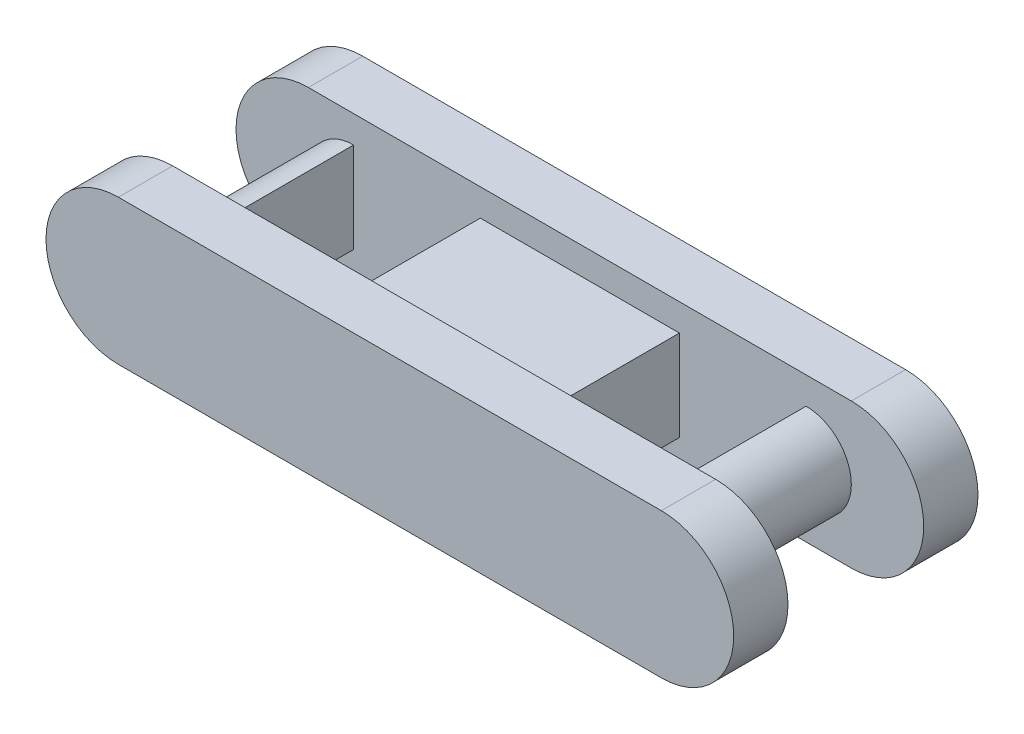
ISO-10303-21;
HEADER;
FILE_DESCRIPTION(('STEP AP214'),'2;1');
FILE_NAME('part.step','',(''),(''),'','','');
FILE_SCHEMA(('AUTOMOTIVE_DESIGN { 1 0 10303 214 1 1 1 1 }'));
ENDSEC;
DATA;
#1=APPLICATION_CONTEXT('core data for automotive mechanical design processes');
#2=APPLICATION_PROTOCOL_DEFINITION('international standard','automotive_design',2000,#1);
#3=PRODUCT_CONTEXT('',#1,'mechanical');
#4=PRODUCT('Part','Part','',(#3));
#5=PRODUCT_RELATED_PRODUCT_CATEGORY('part','',(#4));
#6=PRODUCT_DEFINITION_FORMATION('','',#4);
#7=PRODUCT_DEFINITION_CONTEXT('part definition',#1,'design');
#8=PRODUCT_DEFINITION('design','',#6,#7);
#9=PRODUCT_DEFINITION_SHAPE('','',#8);
#10=(LENGTH_UNIT() NAMED_UNIT(*) SI_UNIT(.MILLI.,.METRE.));
#11=(NAMED_UNIT(*) PLANE_ANGLE_UNIT() SI_UNIT($,.RADIAN.));
#12=(NAMED_UNIT(*) SI_UNIT($,.STERADIAN.) SOLID_ANGLE_UNIT());
#13=UNCERTAINTY_MEASURE_WITH_UNIT(LENGTH_MEASURE(1.E-05),#10,'distance_accuracy_value','');
#14=(GEOMETRIC_REPRESENTATION_CONTEXT(3) GLOBAL_UNCERTAINTY_ASSIGNED_CONTEXT((#13)) GLOBAL_UNIT_ASSIGNED_CONTEXT((#10,
#11,#12)) REPRESENTATION_CONTEXT('',''));
#15=CARTESIAN_POINT('',(0.,0.,0.));
#16=DIRECTION('',(0.,0.,1.));
#17=DIRECTION('',(1.,0.,0.));
#18=AXIS2_PLACEMENT_3D('',#15,#16,#17);
#19=CARTESIAN_POINT('',(15.,0.,3.));
#20=DIRECTION('',(0.,0.,-1.));
#21=DIRECTION('',(-1.,0.,0.));
#22=AXIS2_PLACEMENT_3D('',#19,#20,#21);
#23=CYLINDRICAL_SURFACE('',#22,4.);
#24=CARTESIAN_POINT('',(15.,0.,0.));
#25=DIRECTION('',(0.,0.,1.));
#26=DIRECTION('',(1.,0.,0.));
#27=AXIS2_PLACEMENT_3D('',#24,#25,#26);
#28=CIRCLE('',#27,4.);
#29=CARTESIAN_POINT('',(15.,-4.,0.));
#30=VERTEX_POINT('',#29);
#31=CARTESIAN_POINT('',(15.,4.,0.));
#32=VERTEX_POINT('',#31);
#33=EDGE_CURVE('E208',#30,#32,#28,.T.);
#34=ORIENTED_EDGE('',*,*,#33,.T.);
#35=DIRECTION('',(0.,0.,-1.));
#36=VECTOR('',#35,1.);
#37=CARTESIAN_POINT('',(15.,4.,3.));
#38=LINE('',#37,#36);
#39=CARTESIAN_POINT('',(15.,4.,3.));
#40=VERTEX_POINT('',#39);
#41=EDGE_CURVE('E11',#40,#32,#38,.T.);
#42=ORIENTED_EDGE('',*,*,#41,.F.);
#43=CARTESIAN_POINT('',(15.,0.,3.));
#44=DIRECTION('',(0.,0.,1.));
#45=DIRECTION('',(1.,0.,0.));
#46=AXIS2_PLACEMENT_3D('',#43,#44,#45);
#47=CIRCLE('',#46,4.);
#48=CARTESIAN_POINT('',(15.,-4.,3.));
#49=VERTEX_POINT('',#48);
#50=EDGE_CURVE('E209',#49,#40,#47,.T.);
#51=ORIENTED_EDGE('',*,*,#50,.F.);
#52=DIRECTION('',(0.,0.,-1.));
#53=VECTOR('',#52,1.);
#54=CARTESIAN_POINT('',(15.,-4.,3.));
#55=LINE('',#54,#53);
#56=EDGE_CURVE('E219',#49,#30,#55,.T.);
#57=ORIENTED_EDGE('',*,*,#56,.T.);
#58=EDGE_LOOP('',(#34,#42,#51,#57));
#59=FACE_BOUND('',#58,.T.);
#60=ADVANCED_FACE('F39',(#59),#23,.T.);
#61=CARTESIAN_POINT('',(-15.,4.,3.));
#62=DIRECTION('',(0.,-1.,0.));
#63=DIRECTION('',(0.,0.,-1.));
#64=AXIS2_PLACEMENT_3D('',#61,#62,#63);
#65=PLANE('',#64);
#66=DIRECTION('',(-1.,0.,0.));
#67=VECTOR('',#66,1.);
#68=CARTESIAN_POINT('',(-15.,4.,0.));
#69=LINE('',#68,#67);
#70=CARTESIAN_POINT('',(-15.,4.,0.));
#71=VERTEX_POINT('',#70);
#72=EDGE_CURVE('E222',#32,#71,#69,.T.);
#73=ORIENTED_EDGE('',*,*,#72,.T.);
#74=DIRECTION('',(0.,0.,-1.));
#75=VECTOR('',#74,1.);
#76=CARTESIAN_POINT('',(-15.,4.,3.));
#77=LINE('',#76,#75);
#78=CARTESIAN_POINT('',(-15.,4.,3.));
#79=VERTEX_POINT('',#78);
#80=EDGE_CURVE('E46',#79,#71,#77,.T.);
#81=ORIENTED_EDGE('',*,*,#80,.F.);
#82=DIRECTION('',(-1.,0.,0.));
#83=VECTOR('',#82,1.);
#84=CARTESIAN_POINT('',(-15.,4.,3.));
#85=LINE('',#84,#83);
#86=EDGE_CURVE('E212',#40,#79,#85,.T.);
#87=ORIENTED_EDGE('',*,*,#86,.F.);
#88=ORIENTED_EDGE('',*,*,#41,.T.);
#89=EDGE_LOOP('',(#73,#81,#87,#88));
#90=FACE_BOUND('',#89,.T.);
#91=ADVANCED_FACE('F252',(#90),#65,.F.);
#92=CARTESIAN_POINT('',(-15.,0.,3.));
#93=DIRECTION('',(0.,0.,-1.));
#94=DIRECTION('',(-1.,0.,0.));
#95=AXIS2_PLACEMENT_3D('',#92,#93,#94);
#96=CYLINDRICAL_SURFACE('',#95,4.);
#97=CARTESIAN_POINT('',(-15.,0.,0.));
#98=DIRECTION('',(0.,0.,1.));
#99=DIRECTION('',(1.,0.,0.));
#100=AXIS2_PLACEMENT_3D('',#97,#98,#99);
#101=CIRCLE('',#100,4.);
#102=CARTESIAN_POINT('',(-15.,-4.,0.));
#103=VERTEX_POINT('',#102);
#104=EDGE_CURVE('E224',#71,#103,#101,.T.);
#105=ORIENTED_EDGE('',*,*,#104,.T.);
#106=DIRECTION('',(0.,0.,-1.));
#107=VECTOR('',#106,1.);
#108=CARTESIAN_POINT('',(-15.,-4.,3.));
#109=LINE('',#108,#107);
#110=CARTESIAN_POINT('',(-15.,-4.,3.));
#111=VERTEX_POINT('',#110);
#112=EDGE_CURVE('E229',#111,#103,#109,.T.);
#113=ORIENTED_EDGE('',*,*,#112,.F.);
#114=CARTESIAN_POINT('',(-15.,0.,3.));
#115=DIRECTION('',(0.,0.,1.));
#116=DIRECTION('',(1.,0.,0.));
#117=AXIS2_PLACEMENT_3D('',#114,#115,#116);
#118=CIRCLE('',#117,4.);
#119=EDGE_CURVE('E215',#79,#111,#118,.T.);
#120=ORIENTED_EDGE('',*,*,#119,.F.);
#121=ORIENTED_EDGE('',*,*,#80,.T.);
#122=EDGE_LOOP('',(#105,#113,#120,#121));
#123=FACE_BOUND('',#122,.T.);
#124=ADVANCED_FACE('F236',(#123),#96,.T.);
#125=CARTESIAN_POINT('',(-15.,-4.,3.));
#126=DIRECTION('',(0.,1.,0.));
#127=DIRECTION('',(0.,0.,1.));
#128=AXIS2_PLACEMENT_3D('',#125,#126,#127);
#129=PLANE('',#128);
#130=DIRECTION('',(1.,0.,0.));
#131=VECTOR('',#130,1.);
#132=CARTESIAN_POINT('',(-15.,-4.,0.));
#133=LINE('',#132,#131);
#134=EDGE_CURVE('E213',#103,#30,#133,.T.);
#135=ORIENTED_EDGE('',*,*,#134,.T.);
#136=ORIENTED_EDGE('',*,*,#56,.F.);
#137=DIRECTION('',(1.,0.,0.));
#138=VECTOR('',#137,1.);
#139=CARTESIAN_POINT('',(-15.,-4.,3.));
#140=LINE('',#139,#138);
#141=EDGE_CURVE('E217',#111,#49,#140,.T.);
#142=ORIENTED_EDGE('',*,*,#141,.F.);
#143=ORIENTED_EDGE('',*,*,#112,.T.);
#144=EDGE_LOOP('',(#135,#136,#142,#143));
#145=FACE_BOUND('',#144,.T.);
#146=ADVANCED_FACE('F245',(#145),#129,.F.);
#147=CARTESIAN_POINT('',(15.,0.,3.));
#148=DIRECTION('',(0.,0.,1.));
#149=DIRECTION('',(1.,0.,0.));
#150=AXIS2_PLACEMENT_3D('',#147,#148,#149);
#151=PLANE('',#150);
#152=ORIENTED_EDGE('',*,*,#141,.T.);
#153=ORIENTED_EDGE('',*,*,#50,.T.);
#154=ORIENTED_EDGE('',*,*,#86,.T.);
#155=ORIENTED_EDGE('',*,*,#119,.T.);
#156=EDGE_LOOP('',(#152,#153,#154,#155));
#157=FACE_BOUND('',#156,.T.);
#158=DIRECTION('',(1.,0.,0.));
#159=VECTOR('',#158,1.);
#160=CARTESIAN_POINT('',(-12.5,-2.5,3.));
#161=LINE('',#160,#159);
#162=CARTESIAN_POINT('',(-5.50000000000001,-2.5,3.));
#163=VERTEX_POINT('',#162);
#164=CARTESIAN_POINT('',(5.5,-2.5,3.));
#165=VERTEX_POINT('',#164);
#166=EDGE_CURVE('E182',#163,#165,#161,.T.);
#167=ORIENTED_EDGE('',*,*,#166,.F.);
#168=DIRECTION('',(0.,1.,0.));
#169=VECTOR('',#168,1.);
#170=CARTESIAN_POINT('',(-5.50000000000001,-5.,3.));
#171=LINE('',#170,#169);
#172=CARTESIAN_POINT('',(-5.50000000000001,2.5,3.));
#173=VERTEX_POINT('',#172);
#174=EDGE_CURVE('E163',#163,#173,#171,.T.);
#175=ORIENTED_EDGE('',*,*,#174,.T.);
#176=DIRECTION('',(-1.,0.,0.));
#177=VECTOR('',#176,1.);
#178=CARTESIAN_POINT('',(-12.5,2.5,3.));
#179=LINE('',#178,#177);
#180=CARTESIAN_POINT('',(5.5,2.5,3.));
#181=VERTEX_POINT('',#180);
#182=EDGE_CURVE('E170',#181,#173,#179,.T.);
#183=ORIENTED_EDGE('',*,*,#182,.F.);
#184=DIRECTION('',(0.,1.,0.));
#185=VECTOR('',#184,1.);
#186=CARTESIAN_POINT('',(5.5,-5.,3.));
#187=LINE('',#186,#185);
#188=EDGE_CURVE('E53',#165,#181,#187,.T.);
#189=ORIENTED_EDGE('',*,*,#188,.F.);
#190=EDGE_LOOP('',(#167,#175,#183,#189));
#191=FACE_BOUND('',#190,.T.);
#192=CARTESIAN_POINT('',(12.5,0.,3.));
#193=DIRECTION('',(0.,0.,1.));
#194=DIRECTION('',(1.,0.,0.));
#195=AXIS2_PLACEMENT_3D('',#192,#193,#194);
#196=CIRCLE('',#195,2.5);
#197=CARTESIAN_POINT('',(12.5,-2.5,3.));
#198=VERTEX_POINT('',#197);
#199=CARTESIAN_POINT('',(12.5,2.5,3.));
#200=VERTEX_POINT('',#199);
#201=EDGE_CURVE('E188',#198,#200,#196,.T.);
#202=ORIENTED_EDGE('',*,*,#201,.F.);
#203=DIRECTION('',(0.,1.,0.));
#204=VECTOR('',#203,1.);
#205=CARTESIAN_POINT('',(12.5,-5.,3.));
#206=LINE('',#205,#204);
#207=EDGE_CURVE('E498',#198,#200,#206,.T.);
#208=ORIENTED_EDGE('',*,*,#207,.T.);
#209=EDGE_LOOP('',(#202,#208));
#210=FACE_BOUND('',#209,.T.);
#211=DIRECTION('',(0.,1.,0.));
#212=VECTOR('',#211,1.);
#213=CARTESIAN_POINT('',(-12.5,-5.,3.));
#214=LINE('',#213,#212);
#215=CARTESIAN_POINT('',(-12.5,-2.5,3.));
#216=VERTEX_POINT('',#215);
#217=CARTESIAN_POINT('',(-12.5,2.5,3.));
#218=VERTEX_POINT('',#217);
#219=EDGE_CURVE('E485',#216,#218,#214,.T.);
#220=ORIENTED_EDGE('',*,*,#219,.F.);
#221=CARTESIAN_POINT('',(-12.5,0.,3.));
#222=DIRECTION('',(0.,0.,1.));
#223=DIRECTION('',(1.,0.,0.));
#224=AXIS2_PLACEMENT_3D('',#221,#222,#223);
#225=CIRCLE('',#224,2.5);
#226=EDGE_CURVE('E193',#218,#216,#225,.T.);
#227=ORIENTED_EDGE('',*,*,#226,.F.);
#228=EDGE_LOOP('',(#220,#227));
#229=FACE_BOUND('',#228,.T.);
#230=ADVANCED_FACE('F251',(#157,#191,#210,#229),#151,.T.);
#231=CARTESIAN_POINT('',(15.,0.,0.));
#232=DIRECTION('',(0.,0.,1.));
#233=DIRECTION('',(1.,0.,0.));
#234=AXIS2_PLACEMENT_3D('',#231,#232,#233);
#235=PLANE('',#234);
#236=ORIENTED_EDGE('',*,*,#33,.F.);
#237=ORIENTED_EDGE('',*,*,#134,.F.);
#238=ORIENTED_EDGE('',*,*,#104,.F.);
#239=ORIENTED_EDGE('',*,*,#72,.F.);
#240=EDGE_LOOP('',(#236,#237,#238,#239));
#241=FACE_BOUND('',#240,.T.);
#242=ADVANCED_FACE('F242',(#241),#235,.F.);
#243=CARTESIAN_POINT('',(12.5,0.,10.5));
#244=DIRECTION('',(0.,0.,-1.));
#245=DIRECTION('',(-1.,0.,0.));
#246=AXIS2_PLACEMENT_3D('',#243,#244,#245);
#247=CYLINDRICAL_SURFACE('',#246,2.5);
#248=ORIENTED_EDGE('',*,*,#201,.T.);
#249=DIRECTION('',(0.,0.,-1.));
#250=VECTOR('',#249,1.);
#251=CARTESIAN_POINT('',(12.5,2.5,10.5));
#252=LINE('',#251,#250);
#253=CARTESIAN_POINT('',(12.5,2.5,10.5));
#254=VERTEX_POINT('',#253);
#255=EDGE_CURVE('E205',#254,#200,#252,.T.);
#256=ORIENTED_EDGE('',*,*,#255,.F.);
#257=CARTESIAN_POINT('',(12.5,0.,10.5));
#258=DIRECTION('',(0.,0.,1.));
#259=DIRECTION('',(1.,0.,0.));
#260=AXIS2_PLACEMENT_3D('',#257,#258,#259);
#261=CIRCLE('',#260,2.5);
#262=CARTESIAN_POINT('',(12.5,-2.5,10.5));
#263=VERTEX_POINT('',#262);
#264=EDGE_CURVE('E176',#263,#254,#261,.T.);
#265=ORIENTED_EDGE('',*,*,#264,.F.);
#266=DIRECTION('',(0.,0.,-1.));
#267=VECTOR('',#266,1.);
#268=CARTESIAN_POINT('',(12.5,-2.5,10.5));
#269=LINE('',#268,#267);
#270=EDGE_CURVE('E187',#263,#198,#269,.T.);
#271=ORIENTED_EDGE('',*,*,#270,.T.);
#272=EDGE_LOOP('',(#248,#256,#265,#271));
#273=FACE_BOUND('',#272,.T.);
#274=ADVANCED_FACE('F264',(#273),#247,.T.);
#275=CARTESIAN_POINT('',(-12.5,2.5,10.5));
#276=DIRECTION('',(0.,-1.,0.));
#277=DIRECTION('',(0.,0.,-1.));
#278=AXIS2_PLACEMENT_3D('',#275,#276,#277);
#279=PLANE('',#278);
#280=ORIENTED_EDGE('',*,*,#182,.T.);
#281=DIRECTION('',(0.,0.,-1.));
#282=VECTOR('',#281,1.);
#283=CARTESIAN_POINT('',(-5.50000000000001,2.5,3.));
#284=LINE('',#283,#282);
#285=CARTESIAN_POINT('',(-5.50000000000001,2.5,10.5));
#286=VERTEX_POINT('',#285);
#287=EDGE_CURVE('E155',#286,#173,#284,.T.);
#288=ORIENTED_EDGE('',*,*,#287,.F.);
#289=DIRECTION('',(-1.,0.,0.));
#290=VECTOR('',#289,1.);
#291=CARTESIAN_POINT('',(-12.5,2.5,10.5));
#292=LINE('',#291,#290);
#293=CARTESIAN_POINT('',(5.5,2.5,10.5));
#294=VERTEX_POINT('',#293);
#295=EDGE_CURVE('E169',#294,#286,#292,.T.);
#296=ORIENTED_EDGE('',*,*,#295,.F.);
#297=DIRECTION('',(0.,0.,1.));
#298=VECTOR('',#297,1.);
#299=CARTESIAN_POINT('',(5.5,2.5,3.));
#300=LINE('',#299,#298);
#301=EDGE_CURVE('E60',#181,#294,#300,.T.);
#302=ORIENTED_EDGE('',*,*,#301,.F.);
#303=EDGE_LOOP('',(#280,#288,#296,#302));
#304=FACE_BOUND('',#303,.T.);
#305=ADVANCED_FACE('F168',(#304),#279,.F.);
#306=CARTESIAN_POINT('',(-12.5,0.,10.5));
#307=DIRECTION('',(0.,0.,-1.));
#308=DIRECTION('',(-1.,0.,0.));
#309=AXIS2_PLACEMENT_3D('',#306,#307,#308);
#310=CYLINDRICAL_SURFACE('',#309,2.5);
#311=ORIENTED_EDGE('',*,*,#226,.T.);
#312=DIRECTION('',(0.,0.,-1.));
#313=VECTOR('',#312,1.);
#314=CARTESIAN_POINT('',(-12.5,-2.5,10.5));
#315=LINE('',#314,#313);
#316=CARTESIAN_POINT('',(-12.5,-2.5,10.5));
#317=VERTEX_POINT('',#316);
#318=EDGE_CURVE('E200',#317,#216,#315,.T.);
#319=ORIENTED_EDGE('',*,*,#318,.F.);
#320=CARTESIAN_POINT('',(-12.5,0.,10.5));
#321=DIRECTION('',(0.,0.,1.));
#322=DIRECTION('',(1.,0.,0.));
#323=AXIS2_PLACEMENT_3D('',#320,#321,#322);
#324=CIRCLE('',#323,2.5);
#325=CARTESIAN_POINT('',(-12.5,2.5,10.5));
#326=VERTEX_POINT('',#325);
#327=EDGE_CURVE('E175',#326,#317,#324,.T.);
#328=ORIENTED_EDGE('',*,*,#327,.F.);
#329=DIRECTION('',(0.,0.,-1.));
#330=VECTOR('',#329,1.);
#331=CARTESIAN_POINT('',(-12.5,2.5,10.5));
#332=LINE('',#331,#330);
#333=EDGE_CURVE('E202',#326,#218,#332,.T.);
#334=ORIENTED_EDGE('',*,*,#333,.T.);
#335=EDGE_LOOP('',(#311,#319,#328,#334));
#336=FACE_BOUND('',#335,.T.);
#337=ADVANCED_FACE('F272',(#336),#310,.T.);
#338=CARTESIAN_POINT('',(-12.5,-2.5,10.5));
#339=DIRECTION('',(0.,1.,0.));
#340=DIRECTION('',(0.,0.,1.));
#341=AXIS2_PLACEMENT_3D('',#338,#339,#340);
#342=PLANE('',#341);
#343=DIRECTION('',(1.,0.,0.));
#344=VECTOR('',#343,1.);
#345=CARTESIAN_POINT('',(-12.5,-2.5,10.5));
#346=LINE('',#345,#344);
#347=CARTESIAN_POINT('',(-5.50000000000001,-2.5,10.5));
#348=VERTEX_POINT('',#347);
#349=CARTESIAN_POINT('',(5.5,-2.5,10.5));
#350=VERTEX_POINT('',#349);
#351=EDGE_CURVE('E179',#348,#350,#346,.T.);
#352=ORIENTED_EDGE('',*,*,#351,.F.);
#353=DIRECTION('',(0.,0.,-1.));
#354=VECTOR('',#353,1.);
#355=CARTESIAN_POINT('',(-5.50000000000001,-2.5,10.5));
#356=LINE('',#355,#354);
#357=EDGE_CURVE('E158',#348,#163,#356,.T.);
#358=ORIENTED_EDGE('',*,*,#357,.T.);
#359=ORIENTED_EDGE('',*,*,#166,.T.);
#360=DIRECTION('',(0.,0.,1.));
#361=VECTOR('',#360,1.);
#362=CARTESIAN_POINT('',(5.5,-2.5,10.5));
#363=LINE('',#362,#361);
#364=EDGE_CURVE('E490',#165,#350,#363,.T.);
#365=ORIENTED_EDGE('',*,*,#364,.T.);
#366=EDGE_LOOP('',(#352,#358,#359,#365));
#367=FACE_BOUND('',#366,.T.);
#368=ADVANCED_FACE('F275',(#367),#342,.F.);
#369=CARTESIAN_POINT('',(15.,0.,10.5));
#370=DIRECTION('',(0.,0.,1.));
#371=DIRECTION('',(1.,0.,0.));
#372=AXIS2_PLACEMENT_3D('',#369,#370,#371);
#373=CYLINDRICAL_SURFACE('',#372,4.);
#374=CARTESIAN_POINT('',(15.,0.,13.5));
#375=DIRECTION('',(0.,0.,1.));
#376=DIRECTION('',(1.,0.,0.));
#377=AXIS2_PLACEMENT_3D('',#374,#375,#376);
#378=CIRCLE('',#377,4.);
#379=CARTESIAN_POINT('',(15.,-4.,13.5));
#380=VERTEX_POINT('',#379);
#381=CARTESIAN_POINT('',(15.,4.,13.5));
#382=VERTEX_POINT('',#381);
#383=EDGE_CURVE('E508',#380,#382,#378,.T.);
#384=ORIENTED_EDGE('',*,*,#383,.F.);
#385=DIRECTION('',(0.,0.,1.));
#386=VECTOR('',#385,1.);
#387=CARTESIAN_POINT('',(15.,-4.,10.5));
#388=LINE('',#387,#386);
#389=CARTESIAN_POINT('',(15.,-4.,10.5));
#390=VERTEX_POINT('',#389);
#391=EDGE_CURVE('E191',#390,#380,#388,.T.);
#392=ORIENTED_EDGE('',*,*,#391,.F.);
#393=CARTESIAN_POINT('',(15.,0.,10.5));
#394=DIRECTION('',(0.,0.,1.));
#395=DIRECTION('',(1.,0.,0.));
#396=AXIS2_PLACEMENT_3D('',#393,#394,#395);
#397=CIRCLE('',#396,4.);
#398=CARTESIAN_POINT('',(15.,4.,10.5));
#399=VERTEX_POINT('',#398);
#400=EDGE_CURVE('E509',#390,#399,#397,.T.);
#401=ORIENTED_EDGE('',*,*,#400,.T.);
#402=DIRECTION('',(0.,0.,1.));
#403=VECTOR('',#402,1.);
#404=CARTESIAN_POINT('',(15.,4.,10.5));
#405=LINE('',#404,#403);
#406=EDGE_CURVE('E521',#399,#382,#405,.T.);
#407=ORIENTED_EDGE('',*,*,#406,.T.);
#408=EDGE_LOOP('',(#384,#392,#401,#407));
#409=FACE_BOUND('',#408,.T.);
#410=ADVANCED_FACE('F279',(#409),#373,.T.);
#411=CARTESIAN_POINT('',(-15.,-4.,10.5));
#412=DIRECTION('',(0.,-1.,0.));
#413=DIRECTION('',(0.,0.,-1.));
#414=AXIS2_PLACEMENT_3D('',#411,#412,#413);
#415=PLANE('',#414);
#416=DIRECTION('',(1.,0.,0.));
#417=VECTOR('',#416,1.);
#418=CARTESIAN_POINT('',(-15.,-4.,13.5));
#419=LINE('',#418,#417);
#420=CARTESIAN_POINT('',(-15.,-4.,13.5));
#421=VERTEX_POINT('',#420);
#422=EDGE_CURVE('E524',#421,#380,#419,.T.);
#423=ORIENTED_EDGE('',*,*,#422,.F.);
#424=DIRECTION('',(0.,0.,1.));
#425=VECTOR('',#424,1.);
#426=CARTESIAN_POINT('',(-15.,-4.,10.5));
#427=LINE('',#426,#425);
#428=CARTESIAN_POINT('',(-15.,-4.,10.5));
#429=VERTEX_POINT('',#428);
#430=EDGE_CURVE('E535',#429,#421,#427,.T.);
#431=ORIENTED_EDGE('',*,*,#430,.F.);
#432=DIRECTION('',(1.,0.,0.));
#433=VECTOR('',#432,1.);
#434=CARTESIAN_POINT('',(-15.,-4.,10.5));
#435=LINE('',#434,#433);
#436=EDGE_CURVE('E512',#429,#390,#435,.T.);
#437=ORIENTED_EDGE('',*,*,#436,.T.);
#438=ORIENTED_EDGE('',*,*,#391,.T.);
#439=EDGE_LOOP('',(#423,#431,#437,#438));
#440=FACE_BOUND('',#439,.T.);
#441=ADVANCED_FACE('F283',(#440),#415,.T.);
#442=CARTESIAN_POINT('',(-15.,0.,10.5));
#443=DIRECTION('',(0.,0.,1.));
#444=DIRECTION('',(1.,0.,0.));
#445=AXIS2_PLACEMENT_3D('',#442,#443,#444);
#446=CYLINDRICAL_SURFACE('',#445,4.);
#447=CARTESIAN_POINT('',(-15.,0.,13.5));
#448=DIRECTION('',(0.,0.,1.));
#449=DIRECTION('',(1.,0.,0.));
#450=AXIS2_PLACEMENT_3D('',#447,#448,#449);
#451=CIRCLE('',#450,4.);
#452=CARTESIAN_POINT('',(-15.,4.,13.5));
#453=VERTEX_POINT('',#452);
#454=EDGE_CURVE('E527',#453,#421,#451,.T.);
#455=ORIENTED_EDGE('',*,*,#454,.F.);
#456=DIRECTION('',(0.,0.,1.));
#457=VECTOR('',#456,1.);
#458=CARTESIAN_POINT('',(-15.,4.,10.5));
#459=LINE('',#458,#457);
#460=CARTESIAN_POINT('',(-15.,4.,10.5));
#461=VERTEX_POINT('',#460);
#462=EDGE_CURVE('E533',#461,#453,#459,.T.);
#463=ORIENTED_EDGE('',*,*,#462,.F.);
#464=CARTESIAN_POINT('',(-15.,0.,10.5));
#465=DIRECTION('',(0.,0.,1.));
#466=DIRECTION('',(1.,0.,0.));
#467=AXIS2_PLACEMENT_3D('',#464,#465,#466);
#468=CIRCLE('',#467,4.);
#469=EDGE_CURVE('E515',#461,#429,#468,.T.);
#470=ORIENTED_EDGE('',*,*,#469,.T.);
#471=ORIENTED_EDGE('',*,*,#430,.T.);
#472=EDGE_LOOP('',(#455,#463,#470,#471));
#473=FACE_BOUND('',#472,.T.);
#474=ADVANCED_FACE('F287',(#473),#446,.T.);
#475=CARTESIAN_POINT('',(-15.,4.,10.5));
#476=DIRECTION('',(0.,1.,0.));
#477=DIRECTION('',(0.,0.,1.));
#478=AXIS2_PLACEMENT_3D('',#475,#476,#477);
#479=PLANE('',#478);
#480=DIRECTION('',(-1.,0.,0.));
#481=VECTOR('',#480,1.);
#482=CARTESIAN_POINT('',(-15.,4.,13.5));
#483=LINE('',#482,#481);
#484=EDGE_CURVE('E513',#382,#453,#483,.T.);
#485=ORIENTED_EDGE('',*,*,#484,.F.);
#486=ORIENTED_EDGE('',*,*,#406,.F.);
#487=DIRECTION('',(-1.,0.,0.));
#488=VECTOR('',#487,1.);
#489=CARTESIAN_POINT('',(-15.,4.,10.5));
#490=LINE('',#489,#488);
#491=EDGE_CURVE('E518',#399,#461,#490,.T.);
#492=ORIENTED_EDGE('',*,*,#491,.T.);
#493=ORIENTED_EDGE('',*,*,#462,.T.);
#494=EDGE_LOOP('',(#485,#486,#492,#493));
#495=FACE_BOUND('',#494,.T.);
#496=ADVANCED_FACE('F291',(#495),#479,.T.);
#497=CARTESIAN_POINT('',(15.,0.,10.5));
#498=DIRECTION('',(0.,0.,-1.));
#499=DIRECTION('',(1.,0.,0.));
#500=AXIS2_PLACEMENT_3D('',#497,#498,#499);
#501=PLANE('',#500);
#502=DIRECTION('',(0.,1.,0.));
#503=VECTOR('',#502,1.);
#504=CARTESIAN_POINT('',(-5.50000000000001,-5.,10.5));
#505=LINE('',#504,#503);
#506=EDGE_CURVE('E152',#348,#286,#505,.T.);
#507=ORIENTED_EDGE('',*,*,#506,.F.);
#508=ORIENTED_EDGE('',*,*,#351,.T.);
#509=DIRECTION('',(0.,1.,0.));
#510=VECTOR('',#509,1.);
#511=CARTESIAN_POINT('',(5.5,-5.,10.5));
#512=LINE('',#511,#510);
#513=EDGE_CURVE('E174',#350,#294,#512,.T.);
#514=ORIENTED_EDGE('',*,*,#513,.T.);
#515=ORIENTED_EDGE('',*,*,#295,.T.);
#516=EDGE_LOOP('',(#507,#508,#514,#515));
#517=FACE_BOUND('',#516,.T.);
#518=DIRECTION('',(0.,1.,0.));
#519=VECTOR('',#518,1.);
#520=CARTESIAN_POINT('',(12.5,-5.,10.5));
#521=LINE('',#520,#519);
#522=EDGE_CURVE('E502',#263,#254,#521,.T.);
#523=ORIENTED_EDGE('',*,*,#522,.F.);
#524=ORIENTED_EDGE('',*,*,#264,.T.);
#525=EDGE_LOOP('',(#523,#524));
#526=FACE_BOUND('',#525,.T.);
#527=ORIENTED_EDGE('',*,*,#327,.T.);
#528=DIRECTION('',(0.,1.,0.));
#529=VECTOR('',#528,1.);
#530=CARTESIAN_POINT('',(-12.5,-5.,10.5));
#531=LINE('',#530,#529);
#532=EDGE_CURVE('E164',#317,#326,#531,.T.);
#533=ORIENTED_EDGE('',*,*,#532,.T.);
#534=EDGE_LOOP('',(#527,#533));
#535=FACE_BOUND('',#534,.T.);
#536=ORIENTED_EDGE('',*,*,#400,.F.);
#537=ORIENTED_EDGE('',*,*,#436,.F.);
#538=ORIENTED_EDGE('',*,*,#469,.F.);
#539=ORIENTED_EDGE('',*,*,#491,.F.);
#540=EDGE_LOOP('',(#536,#537,#538,#539));
#541=FACE_BOUND('',#540,.T.);
#542=ADVANCED_FACE('F172',(#517,#526,#535,#541),#501,.T.);
#543=CARTESIAN_POINT('',(15.,0.,13.5));
#544=DIRECTION('',(0.,0.,-1.));
#545=DIRECTION('',(1.,0.,0.));
#546=AXIS2_PLACEMENT_3D('',#543,#544,#545);
#547=PLANE('',#546);
#548=ORIENTED_EDGE('',*,*,#383,.T.);
#549=ORIENTED_EDGE('',*,*,#484,.T.);
#550=ORIENTED_EDGE('',*,*,#454,.T.);
#551=ORIENTED_EDGE('',*,*,#422,.T.);
#552=EDGE_LOOP('',(#548,#549,#550,#551));
#553=FACE_BOUND('',#552,.T.);
#554=ADVANCED_FACE('F296',(#553),#547,.F.);
#555=CARTESIAN_POINT('',(12.5,-5.,3.));
#556=DIRECTION('',(1.,0.,0.));
#557=DIRECTION('',(0.,0.,-1.));
#558=AXIS2_PLACEMENT_3D('',#555,#556,#557);
#559=PLANE('',#558);
#560=ORIENTED_EDGE('',*,*,#522,.T.);
#561=ORIENTED_EDGE('',*,*,#255,.T.);
#562=ORIENTED_EDGE('',*,*,#207,.F.);
#563=ORIENTED_EDGE('',*,*,#270,.F.);
#564=EDGE_LOOP('',(#560,#561,#562,#563));
#565=FACE_BOUND('',#564,.T.);
#566=ADVANCED_FACE('F299',(#565),#559,.F.);
#567=CARTESIAN_POINT('',(5.5,-5.,3.));
#568=DIRECTION('',(-1.,0.,0.));
#569=DIRECTION('',(0.,0.,1.));
#570=AXIS2_PLACEMENT_3D('',#567,#568,#569);
#571=PLANE('',#570);
#572=ORIENTED_EDGE('',*,*,#188,.T.);
#573=ORIENTED_EDGE('',*,*,#301,.T.);
#574=ORIENTED_EDGE('',*,*,#513,.F.);
#575=ORIENTED_EDGE('',*,*,#364,.F.);
#576=EDGE_LOOP('',(#572,#573,#574,#575));
#577=FACE_BOUND('',#576,.T.);
#578=ADVANCED_FACE('F303',(#577),#571,.F.);
#579=CARTESIAN_POINT('',(-12.5,-5.,3.));
#580=DIRECTION('',(-1.,0.,0.));
#581=DIRECTION('',(0.,0.,1.));
#582=AXIS2_PLACEMENT_3D('',#579,#580,#581);
#583=PLANE('',#582);
#584=ORIENTED_EDGE('',*,*,#219,.T.);
#585=ORIENTED_EDGE('',*,*,#333,.F.);
#586=ORIENTED_EDGE('',*,*,#532,.F.);
#587=ORIENTED_EDGE('',*,*,#318,.T.);
#588=EDGE_LOOP('',(#584,#585,#586,#587));
#589=FACE_BOUND('',#588,.T.);
#590=ADVANCED_FACE('F306',(#589),#583,.F.);
#591=CARTESIAN_POINT('',(-5.50000000000001,-5.,3.));
#592=DIRECTION('',(1.,0.,0.));
#593=DIRECTION('',(0.,0.,-1.));
#594=AXIS2_PLACEMENT_3D('',#591,#592,#593);
#595=PLANE('',#594);
#596=ORIENTED_EDGE('',*,*,#506,.T.);
#597=ORIENTED_EDGE('',*,*,#287,.T.);
#598=ORIENTED_EDGE('',*,*,#174,.F.);
#599=ORIENTED_EDGE('',*,*,#357,.F.);
#600=EDGE_LOOP('',(#596,#597,#598,#599));
#601=FACE_BOUND('',#600,.T.);
#602=ADVANCED_FACE('F154',(#601),#595,.F.);
#603=CLOSED_SHELL('',(#60,#91,#124,#146,#230,#242,#274,#305,#337,#368,#410,#441,#474,#496,#542,
#554,#566,#578,#590,#602));
#604=MANIFOLD_SOLID_BREP('B2',#603);
#605=ADVANCED_BREP_SHAPE_REPRESENTATION('',(#18,#604),#14);
#606=SHAPE_DEFINITION_REPRESENTATION(#9,#605);
ENDSEC;
END-ISO-10303-21;
